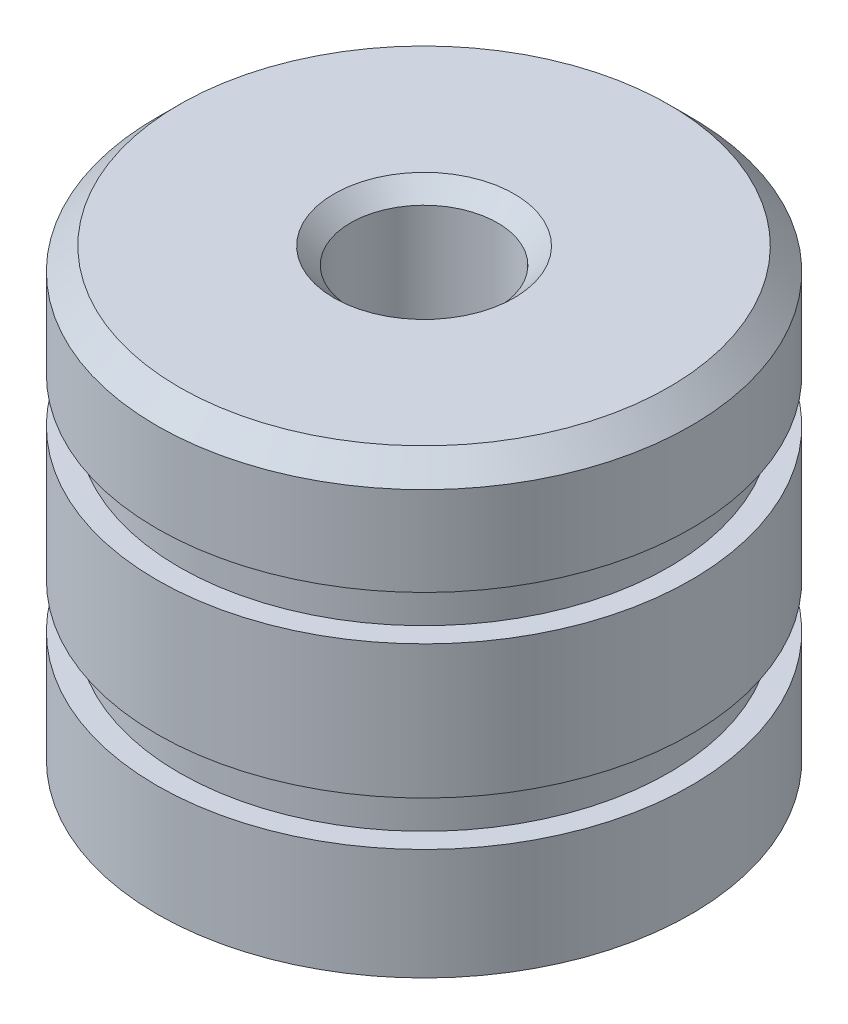
ISO-10303-21;
HEADER;
FILE_DESCRIPTION(('STEP AP214'),'2;1');
FILE_NAME('part.step','',(''),(''),'','','');
FILE_SCHEMA(('AUTOMOTIVE_DESIGN { 1 0 10303 214 1 1 1 1 }'));
ENDSEC;
DATA;
#1=APPLICATION_CONTEXT('core data for automotive mechanical design processes');
#2=APPLICATION_PROTOCOL_DEFINITION('international standard','automotive_design',2000,#1);
#3=PRODUCT_CONTEXT('',#1,'mechanical');
#4=PRODUCT('Part','Part','',(#3));
#5=PRODUCT_RELATED_PRODUCT_CATEGORY('part','',(#4));
#6=PRODUCT_DEFINITION_FORMATION('','',#4);
#7=PRODUCT_DEFINITION_CONTEXT('part definition',#1,'design');
#8=PRODUCT_DEFINITION('design','',#6,#7);
#9=PRODUCT_DEFINITION_SHAPE('','',#8);
#10=(LENGTH_UNIT() NAMED_UNIT(*) SI_UNIT(.MILLI.,.METRE.));
#11=(NAMED_UNIT(*) PLANE_ANGLE_UNIT() SI_UNIT($,.RADIAN.));
#12=(NAMED_UNIT(*) SI_UNIT($,.STERADIAN.) SOLID_ANGLE_UNIT());
#13=UNCERTAINTY_MEASURE_WITH_UNIT(LENGTH_MEASURE(1.E-05),#10,'distance_accuracy_value','');
#14=(GEOMETRIC_REPRESENTATION_CONTEXT(3) GLOBAL_UNCERTAINTY_ASSIGNED_CONTEXT((#13)) GLOBAL_UNIT_ASSIGNED_CONTEXT((#10,
#11,#12)) REPRESENTATION_CONTEXT('',''));
#15=CARTESIAN_POINT('',(0.,0.,0.));
#16=DIRECTION('',(0.,0.,1.));
#17=DIRECTION('',(1.,0.,0.));
#18=AXIS2_PLACEMENT_3D('',#15,#16,#17);
#19=CARTESIAN_POINT('',(0.,5.,0.));
#20=DIRECTION('',(0.,-1.,0.));
#21=DIRECTION('',(0.,0.,-1.));
#22=AXIS2_PLACEMENT_3D('',#19,#20,#21);
#23=CYLINDRICAL_SURFACE('',#22,6.);
#24=CARTESIAN_POINT('',(0.,1.5,0.));
#25=DIRECTION('',(0.,1.,0.));
#26=DIRECTION('',(0.,0.,1.));
#27=AXIS2_PLACEMENT_3D('',#24,#25,#26);
#28=CIRCLE('',#27,6.);
#29=CARTESIAN_POINT('',(0.,1.5,6.));
#30=VERTEX_POINT('',#29);
#31=EDGE_CURVE('E79',#30,#30,#28,.T.);
#32=ORIENTED_EDGE('',*,*,#31,.F.);
#33=EDGE_LOOP('',(#32));
#34=FACE_BOUND('',#33,.T.);
#35=CARTESIAN_POINT('',(0.,-1.5,0.));
#36=DIRECTION('',(0.,1.,0.));
#37=DIRECTION('',(0.,0.,1.));
#38=AXIS2_PLACEMENT_3D('',#35,#36,#37);
#39=CIRCLE('',#38,6.);
#40=CARTESIAN_POINT('',(0.,-1.5,6.));
#41=VERTEX_POINT('',#40);
#42=EDGE_CURVE('E67',#41,#41,#39,.T.);
#43=ORIENTED_EDGE('',*,*,#42,.T.);
#44=EDGE_LOOP('',(#43));
#45=FACE_BOUND('',#44,.T.);
#46=ADVANCED_FACE('F34',(#34,#45),#23,.T.);
#47=CARTESIAN_POINT('',(0.,1.5,0.));
#48=DIRECTION('',(0.,1.,0.));
#49=DIRECTION('',(0.,0.,1.));
#50=AXIS2_PLACEMENT_3D('',#47,#48,#49);
#51=PLANE('',#50);
#52=CARTESIAN_POINT('',(0.,1.5,0.));
#53=DIRECTION('',(0.,1.,0.));
#54=DIRECTION('',(0.,0.,1.));
#55=AXIS2_PLACEMENT_3D('',#52,#53,#54);
#56=CIRCLE('',#55,5.5);
#57=CARTESIAN_POINT('',(0.,1.5,5.5));
#58=VERTEX_POINT('',#57);
#59=EDGE_CURVE('E73',#58,#58,#56,.T.);
#60=ORIENTED_EDGE('',*,*,#59,.F.);
#61=EDGE_LOOP('',(#60));
#62=FACE_BOUND('',#61,.T.);
#63=ORIENTED_EDGE('',*,*,#31,.T.);
#64=EDGE_LOOP('',(#63));
#65=FACE_BOUND('',#64,.T.);
#66=ADVANCED_FACE('F102',(#62,#65),#51,.T.);
#67=CARTESIAN_POINT('',(0.,2.5,0.));
#68=DIRECTION('',(0.,1.,0.));
#69=DIRECTION('',(0.,0.,1.));
#70=AXIS2_PLACEMENT_3D('',#67,#68,#69);
#71=PLANE('',#70);
#72=CARTESIAN_POINT('',(0.,2.5,0.));
#73=DIRECTION('',(0.,1.,0.));
#74=DIRECTION('',(0.,0.,1.));
#75=AXIS2_PLACEMENT_3D('',#72,#73,#74);
#76=CIRCLE('',#75,5.5);
#77=CARTESIAN_POINT('',(0.,2.5,5.5));
#78=VERTEX_POINT('',#77);
#79=EDGE_CURVE('E70',#78,#78,#76,.T.);
#80=ORIENTED_EDGE('',*,*,#79,.T.);
#81=EDGE_LOOP('',(#80));
#82=FACE_BOUND('',#81,.T.);
#83=CARTESIAN_POINT('',(0.,2.5,0.));
#84=DIRECTION('',(0.,1.,0.));
#85=DIRECTION('',(0.,0.,1.));
#86=AXIS2_PLACEMENT_3D('',#83,#84,#85);
#87=CIRCLE('',#86,6.);
#88=CARTESIAN_POINT('',(0.,2.5,6.));
#89=VERTEX_POINT('',#88);
#90=EDGE_CURVE('E76',#89,#89,#87,.T.);
#91=ORIENTED_EDGE('',*,*,#90,.F.);
#92=EDGE_LOOP('',(#91));
#93=FACE_BOUND('',#92,.T.);
#94=ADVANCED_FACE('F107',(#82,#93),#71,.F.);
#95=CARTESIAN_POINT('',(0.,1.5,0.));
#96=DIRECTION('',(0.,1.,0.));
#97=DIRECTION('',(0.,0.,1.));
#98=AXIS2_PLACEMENT_3D('',#95,#96,#97);
#99=CYLINDRICAL_SURFACE('',#98,5.5);
#100=ORIENTED_EDGE('',*,*,#59,.T.);
#101=EDGE_LOOP('',(#100));
#102=FACE_BOUND('',#101,.T.);
#103=ORIENTED_EDGE('',*,*,#79,.F.);
#104=EDGE_LOOP('',(#103));
#105=FACE_BOUND('',#104,.T.);
#106=ADVANCED_FACE('F123',(#102,#105),#99,.T.);
#107=CARTESIAN_POINT('',(0.,5.,0.));
#108=DIRECTION('',(0.,1.,0.));
#109=DIRECTION('',(0.,0.,1.));
#110=AXIS2_PLACEMENT_3D('',#107,#108,#109);
#111=PLANE('',#110);
#112=CARTESIAN_POINT('',(0.,5.,0.));
#113=DIRECTION('',(0.,1.,0.));
#114=DIRECTION('',(0.,0.,1.));
#115=AXIS2_PLACEMENT_3D('',#112,#113,#114);
#116=CIRCLE('',#115,2.025);
#117=CARTESIAN_POINT('',(0.,5.,2.025));
#118=VERTEX_POINT('',#117);
#119=EDGE_CURVE('E60',#118,#118,#116,.T.);
#120=ORIENTED_EDGE('',*,*,#119,.F.);
#121=EDGE_LOOP('',(#120));
#122=FACE_BOUND('',#121,.T.);
#123=CARTESIAN_POINT('',(0.,5.,0.));
#124=DIRECTION('',(0.,1.,0.));
#125=DIRECTION('',(0.,0.,1.));
#126=AXIS2_PLACEMENT_3D('',#123,#124,#125);
#127=CIRCLE('',#126,5.50000000000001);
#128=CARTESIAN_POINT('',(0.,5.,5.50000000000001));
#129=VERTEX_POINT('',#128);
#130=EDGE_CURVE('E41',#129,#129,#127,.T.);
#131=ORIENTED_EDGE('',*,*,#130,.T.);
#132=EDGE_LOOP('',(#131));
#133=FACE_BOUND('',#132,.T.);
#134=ADVANCED_FACE('F89',(#122,#133),#111,.T.);
#135=CARTESIAN_POINT('',(0.,4.5,0.));
#136=DIRECTION('',(0.,1.,0.));
#137=DIRECTION('',(0.,0.,1.));
#138=AXIS2_PLACEMENT_3D('',#135,#136,#137);
#139=CIRCLE('',#138,6.);
#140=CARTESIAN_POINT('',(0.,4.5,6.));
#141=VERTEX_POINT('',#140);
#142=EDGE_CURVE('E11',#141,#141,#139,.F.);
#143=ORIENTED_EDGE('',*,*,#142,.T.);
#144=EDGE_LOOP('',(#143));
#145=FACE_BOUND('',#144,.T.);
#146=ORIENTED_EDGE('',*,*,#90,.T.);
#147=EDGE_LOOP('',(#146));
#148=FACE_BOUND('',#147,.T.);
#149=ADVANCED_FACE('F99',(#145,#148),#23,.T.);
#150=CARTESIAN_POINT('',(0.,-1.5,0.));
#151=DIRECTION('',(0.,-1.,0.));
#152=DIRECTION('',(0.,0.,1.));
#153=AXIS2_PLACEMENT_3D('',#150,#151,#152);
#154=PLANE('',#153);
#155=ORIENTED_EDGE('',*,*,#42,.F.);
#156=EDGE_LOOP('',(#155));
#157=FACE_BOUND('',#156,.T.);
#158=CARTESIAN_POINT('',(0.,-1.5,0.));
#159=DIRECTION('',(0.,1.,0.));
#160=DIRECTION('',(0.,0.,1.));
#161=AXIS2_PLACEMENT_3D('',#158,#159,#160);
#162=CIRCLE('',#161,5.5);
#163=CARTESIAN_POINT('',(0.,-1.5,5.5));
#164=VERTEX_POINT('',#163);
#165=EDGE_CURVE('E57',#164,#164,#162,.T.);
#166=ORIENTED_EDGE('',*,*,#165,.T.);
#167=EDGE_LOOP('',(#166));
#168=FACE_BOUND('',#167,.T.);
#169=ADVANCED_FACE('F114',(#157,#168),#154,.T.);
#170=CARTESIAN_POINT('',(0.,-2.5,0.));
#171=DIRECTION('',(0.,-1.,0.));
#172=DIRECTION('',(0.,0.,1.));
#173=AXIS2_PLACEMENT_3D('',#170,#171,#172);
#174=PLANE('',#173);
#175=CARTESIAN_POINT('',(0.,-2.5,0.));
#176=DIRECTION('',(0.,1.,0.));
#177=DIRECTION('',(0.,0.,1.));
#178=AXIS2_PLACEMENT_3D('',#175,#176,#177);
#179=CIRCLE('',#178,6.);
#180=CARTESIAN_POINT('',(0.,-2.5,6.));
#181=VERTEX_POINT('',#180);
#182=EDGE_CURVE('E65',#181,#181,#179,.T.);
#183=ORIENTED_EDGE('',*,*,#182,.T.);
#184=EDGE_LOOP('',(#183));
#185=FACE_BOUND('',#184,.T.);
#186=CARTESIAN_POINT('',(0.,-2.5,0.));
#187=DIRECTION('',(0.,1.,0.));
#188=DIRECTION('',(0.,0.,1.));
#189=AXIS2_PLACEMENT_3D('',#186,#187,#188);
#190=CIRCLE('',#189,5.5);
#191=CARTESIAN_POINT('',(0.,-2.5,5.5));
#192=VERTEX_POINT('',#191);
#193=EDGE_CURVE('E53',#192,#192,#190,.T.);
#194=ORIENTED_EDGE('',*,*,#193,.F.);
#195=EDGE_LOOP('',(#194));
#196=FACE_BOUND('',#195,.T.);
#197=ADVANCED_FACE('F120',(#185,#196),#174,.F.);
#198=CARTESIAN_POINT('',(0.,-1.5,0.));
#199=DIRECTION('',(0.,-1.,0.));
#200=DIRECTION('',(0.,0.,-1.));
#201=AXIS2_PLACEMENT_3D('',#198,#199,#200);
#202=CYLINDRICAL_SURFACE('',#201,5.5);
#203=ORIENTED_EDGE('',*,*,#165,.F.);
#204=EDGE_LOOP('',(#203));
#205=FACE_BOUND('',#204,.T.);
#206=ORIENTED_EDGE('',*,*,#193,.T.);
#207=EDGE_LOOP('',(#206));
#208=FACE_BOUND('',#207,.T.);
#209=ADVANCED_FACE('F138',(#205,#208),#202,.T.);
#210=CARTESIAN_POINT('',(0.,-5.,0.));
#211=DIRECTION('',(0.,1.,0.));
#212=DIRECTION('',(0.,0.,1.));
#213=AXIS2_PLACEMENT_3D('',#210,#211,#212);
#214=PLANE('',#213);
#215=CARTESIAN_POINT('',(0.,-5.,0.));
#216=DIRECTION('',(0.,1.,0.));
#217=DIRECTION('',(0.,0.,1.));
#218=AXIS2_PLACEMENT_3D('',#215,#216,#217);
#219=CIRCLE('',#218,6.);
#220=CARTESIAN_POINT('',(0.,-5.,6.));
#221=VERTEX_POINT('',#220);
#222=EDGE_CURVE('E82',#221,#221,#219,.T.);
#223=ORIENTED_EDGE('',*,*,#222,.F.);
#224=EDGE_LOOP('',(#223));
#225=FACE_BOUND('',#224,.T.);
#226=ADVANCED_FACE('F97',(#225),#214,.F.);
#227=ORIENTED_EDGE('',*,*,#182,.F.);
#228=EDGE_LOOP('',(#227));
#229=FACE_BOUND('',#228,.T.);
#230=ORIENTED_EDGE('',*,*,#222,.T.);
#231=EDGE_LOOP('',(#230));
#232=FACE_BOUND('',#231,.T.);
#233=ADVANCED_FACE('F92',(#229,#232),#23,.T.);
#234=CARTESIAN_POINT('',(0.,5.,0.));
#235=DIRECTION('',(0.,-1.,0.));
#236=DIRECTION('',(0.,0.,-1.));
#237=AXIS2_PLACEMENT_3D('',#234,#235,#236);
#238=CONICAL_SURFACE('',#237,5.50000000000001,0.785398163397444);
#239=ORIENTED_EDGE('',*,*,#142,.F.);
#240=EDGE_LOOP('',(#239));
#241=FACE_BOUND('',#240,.T.);
#242=ORIENTED_EDGE('',*,*,#130,.F.);
#243=EDGE_LOOP('',(#242));
#244=FACE_BOUND('',#243,.T.);
#245=ADVANCED_FACE('F36',(#241,#244),#238,.T.);
#246=CARTESIAN_POINT('',(0.,-3.,0.));
#247=DIRECTION('',(0.,1.,0.));
#248=DIRECTION('',(0.,0.,1.));
#249=AXIS2_PLACEMENT_3D('',#246,#247,#248);
#250=CONICAL_SURFACE('',#249,1.65,1.02974425867665);
#251=CARTESIAN_POINT('',(0.,-3.99142002139548,0.));
#252=VERTEX_POINT('',#251);
#253=VERTEX_LOOP('',#252);
#254=FACE_BOUND('',#253,.T.);
#255=CARTESIAN_POINT('',(0.,-3.,0.));
#256=DIRECTION('',(0.,1.,0.));
#257=DIRECTION('',(0.,0.,1.));
#258=AXIS2_PLACEMENT_3D('',#255,#256,#257);
#259=CIRCLE('',#258,1.65);
#260=CARTESIAN_POINT('',(0.,-3.,1.65));
#261=VERTEX_POINT('',#260);
#262=EDGE_CURVE('E51',#261,#261,#259,.T.);
#263=ORIENTED_EDGE('',*,*,#262,.T.);
#264=EDGE_LOOP('',(#263));
#265=FACE_BOUND('',#264,.T.);
#266=ADVANCED_FACE('F44',(#254,#265),#250,.F.);
#267=CARTESIAN_POINT('',(0.,5.,0.));
#268=DIRECTION('',(0.,1.,0.));
#269=DIRECTION('',(0.,0.,1.));
#270=AXIS2_PLACEMENT_3D('',#267,#268,#269);
#271=CYLINDRICAL_SURFACE('',#270,1.65);
#272=ORIENTED_EDGE('',*,*,#262,.F.);
#273=EDGE_LOOP('',(#272));
#274=FACE_BOUND('',#273,.T.);
#275=CARTESIAN_POINT('',(0.,4.625,0.));
#276=DIRECTION('',(0.,1.,0.));
#277=DIRECTION('',(0.,0.,1.));
#278=AXIS2_PLACEMENT_3D('',#275,#276,#277);
#279=CIRCLE('',#278,1.65);
#280=CARTESIAN_POINT('',(0.,4.625,1.65));
#281=VERTEX_POINT('',#280);
#282=EDGE_CURVE('E54',#281,#281,#279,.T.);
#283=ORIENTED_EDGE('',*,*,#282,.T.);
#284=EDGE_LOOP('',(#283));
#285=FACE_BOUND('',#284,.T.);
#286=ADVANCED_FACE('F47',(#274,#285),#271,.F.);
#287=CARTESIAN_POINT('',(0.,5.,0.));
#288=DIRECTION('',(0.,1.,0.));
#289=DIRECTION('',(0.,0.,1.));
#290=AXIS2_PLACEMENT_3D('',#287,#288,#289);
#291=CONICAL_SURFACE('',#290,2.025,0.78539816339745);
#292=ORIENTED_EDGE('',*,*,#282,.F.);
#293=EDGE_LOOP('',(#292));
#294=FACE_BOUND('',#293,.T.);
#295=ORIENTED_EDGE('',*,*,#119,.T.);
#296=EDGE_LOOP('',(#295));
#297=FACE_BOUND('',#296,.T.);
#298=ADVANCED_FACE('F157',(#294,#297),#291,.F.);
#299=CLOSED_SHELL('',(#46,#66,#94,#106,#134,#149,#169,#197,#209,#226,#233,#245,#266,#286,#298));
#300=MANIFOLD_SOLID_BREP('B2',#299);
#301=ADVANCED_BREP_SHAPE_REPRESENTATION('',(#18,#300),#14);
#302=SHAPE_DEFINITION_REPRESENTATION(#9,#301);
ENDSEC;
END-ISO-10303-21;
